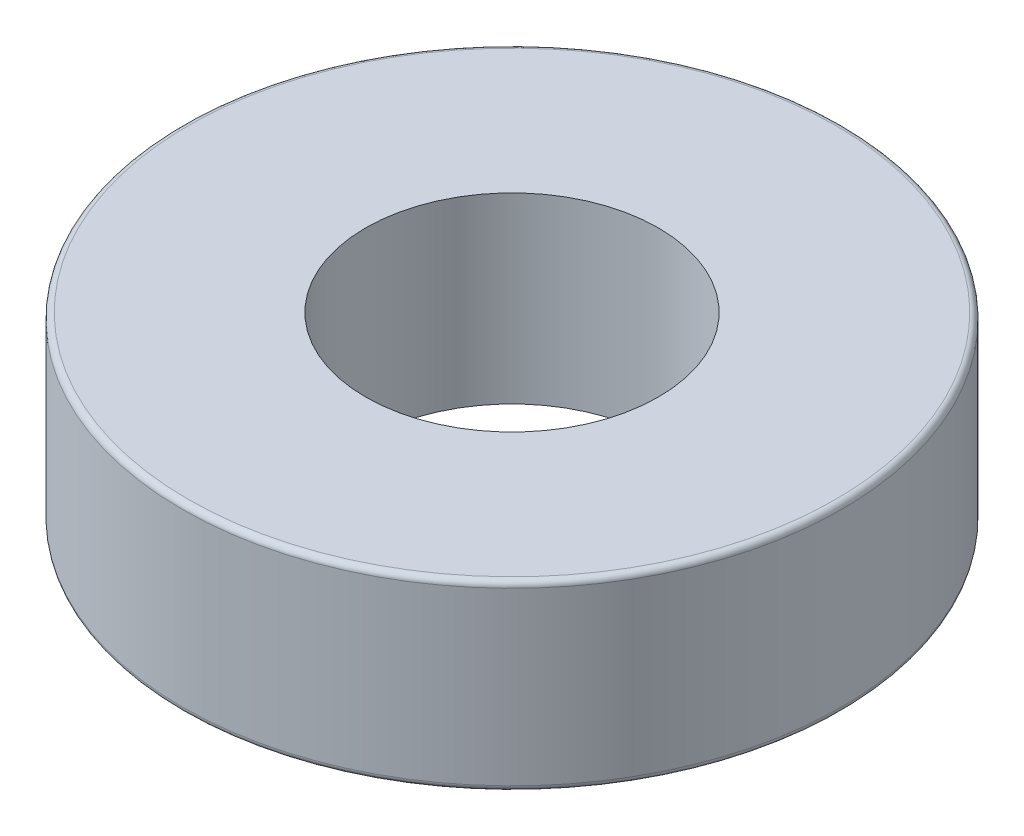
ISO-10303-21;
HEADER;
FILE_DESCRIPTION(('STEP AP214'),'2;1');
FILE_NAME('part.step','',(''),(''),'','','');
FILE_SCHEMA(('AUTOMOTIVE_DESIGN { 1 0 10303 214 1 1 1 1 }'));
ENDSEC;
DATA;
#1=APPLICATION_CONTEXT('core data for automotive mechanical design processes');
#2=APPLICATION_PROTOCOL_DEFINITION('international standard','automotive_design',2000,#1);
#3=PRODUCT_CONTEXT('',#1,'mechanical');
#4=PRODUCT('Part','Part','',(#3));
#5=PRODUCT_RELATED_PRODUCT_CATEGORY('part','',(#4));
#6=PRODUCT_DEFINITION_FORMATION('','',#4);
#7=PRODUCT_DEFINITION_CONTEXT('part definition',#1,'design');
#8=PRODUCT_DEFINITION('design','',#6,#7);
#9=PRODUCT_DEFINITION_SHAPE('','',#8);
#10=(LENGTH_UNIT() NAMED_UNIT(*) SI_UNIT(.MILLI.,.METRE.));
#11=(NAMED_UNIT(*) PLANE_ANGLE_UNIT() SI_UNIT($,.RADIAN.));
#12=(NAMED_UNIT(*) SI_UNIT($,.STERADIAN.) SOLID_ANGLE_UNIT());
#13=UNCERTAINTY_MEASURE_WITH_UNIT(LENGTH_MEASURE(1.E-05),#10,'distance_accuracy_value','');
#14=(GEOMETRIC_REPRESENTATION_CONTEXT(3) GLOBAL_UNCERTAINTY_ASSIGNED_CONTEXT((#13)) GLOBAL_UNIT_ASSIGNED_CONTEXT((#10,
#11,#12)) REPRESENTATION_CONTEXT('',''));
#15=CARTESIAN_POINT('',(0.,0.,0.));
#16=DIRECTION('',(0.,0.,1.));
#17=DIRECTION('',(1.,0.,0.));
#18=AXIS2_PLACEMENT_3D('',#15,#16,#17);
#19=CARTESIAN_POINT('',(0.,0.254,0.));
#20=DIRECTION('',(0.,-1.,0.));
#21=DIRECTION('',(0.,0.,-1.));
#22=AXIS2_PLACEMENT_3D('',#19,#20,#21);
#23=TOROIDAL_SURFACE('',#22,14.0335,0.254);
#24=CARTESIAN_POINT('',(0.,0.254,0.));
#25=DIRECTION('',(0.,-1.,0.));
#26=DIRECTION('',(0.,0.,-1.));
#27=AXIS2_PLACEMENT_3D('',#24,#25,#26);
#28=CIRCLE('',#27,14.2875);
#29=CARTESIAN_POINT('',(0.,0.254,-14.2875));
#30=VERTEX_POINT('',#29);
#31=EDGE_CURVE('E54',#30,#30,#28,.F.);
#32=ORIENTED_EDGE('',*,*,#31,.F.);
#33=EDGE_LOOP('',(#32));
#34=FACE_BOUND('',#33,.T.);
#35=CARTESIAN_POINT('',(0.,0.,0.));
#36=DIRECTION('',(0.,1.,0.));
#37=DIRECTION('',(0.,0.,-1.));
#38=AXIS2_PLACEMENT_3D('',#35,#36,#37);
#39=CIRCLE('',#38,14.0335);
#40=CARTESIAN_POINT('',(0.,0.,14.0335));
#41=VERTEX_POINT('',#40);
#42=CARTESIAN_POINT('',(0.,0.,-14.0335));
#43=VERTEX_POINT('',#42);
#44=EDGE_CURVE('E46',#41,#43,#39,.F.);
#45=ORIENTED_EDGE('',*,*,#44,.F.);
#46=CARTESIAN_POINT('',(0.,0.,0.));
#47=DIRECTION('',(0.,1.,0.));
#48=DIRECTION('',(0.,0.,1.));
#49=AXIS2_PLACEMENT_3D('',#46,#47,#48);
#50=CIRCLE('',#49,14.0335);
#51=EDGE_CURVE('E44',#43,#41,#50,.F.);
#52=ORIENTED_EDGE('',*,*,#51,.F.);
#53=EDGE_LOOP('',(#45,#52));
#54=FACE_BOUND('',#53,.T.);
#55=ADVANCED_FACE('F16',(#34,#54),#23,.T.);
#56=CARTESIAN_POINT('',(0.,0.,0.));
#57=DIRECTION('',(0.,-1.,0.));
#58=DIRECTION('',(0.,0.,-1.));
#59=AXIS2_PLACEMENT_3D('',#56,#57,#58);
#60=CYLINDRICAL_SURFACE('',#59,14.2875);
#61=CARTESIAN_POINT('',(0.,7.6708,0.));
#62=DIRECTION('',(0.,1.,0.));
#63=DIRECTION('',(0.,0.,1.));
#64=AXIS2_PLACEMENT_3D('',#61,#62,#63);
#65=CIRCLE('',#64,14.2875);
#66=CARTESIAN_POINT('',(0.,7.6708,14.2875));
#67=VERTEX_POINT('',#66);
#68=EDGE_CURVE('E50',#67,#67,#65,.T.);
#69=ORIENTED_EDGE('',*,*,#68,.F.);
#70=EDGE_LOOP('',(#69));
#71=FACE_BOUND('',#70,.T.);
#72=ORIENTED_EDGE('',*,*,#31,.T.);
#73=EDGE_LOOP('',(#72));
#74=FACE_BOUND('',#73,.T.);
#75=ADVANCED_FACE('F72',(#71,#74),#60,.T.);
#76=CARTESIAN_POINT('',(6.35,0.,0.));
#77=DIRECTION('',(0.,-1.,0.));
#78=DIRECTION('',(0.,0.,-1.));
#79=AXIS2_PLACEMENT_3D('',#76,#77,#78);
#80=PLANE('',#79);
#81=CARTESIAN_POINT('',(0.,0.,0.));
#82=DIRECTION('',(0.,-1.,0.));
#83=DIRECTION('',(0.,0.,-1.));
#84=AXIS2_PLACEMENT_3D('',#81,#82,#83);
#85=CIRCLE('',#84,6.35);
#86=CARTESIAN_POINT('',(0.,0.,-6.35));
#87=VERTEX_POINT('',#86);
#88=EDGE_CURVE('E87',#87,#87,#85,.F.);
#89=ORIENTED_EDGE('',*,*,#88,.T.);
#90=EDGE_LOOP('',(#89));
#91=FACE_BOUND('',#90,.T.);
#92=ORIENTED_EDGE('',*,*,#51,.T.);
#93=ORIENTED_EDGE('',*,*,#44,.T.);
#94=EDGE_LOOP('',(#92,#93));
#95=FACE_BOUND('',#94,.T.);
#96=ADVANCED_FACE('F53',(#91,#95),#80,.T.);
#97=CARTESIAN_POINT('',(0.,7.6708,0.));
#98=DIRECTION('',(0.,1.,0.));
#99=DIRECTION('',(0.,0.,1.));
#100=AXIS2_PLACEMENT_3D('',#97,#98,#99);
#101=TOROIDAL_SURFACE('',#100,14.0335,0.254);
#102=ORIENTED_EDGE('',*,*,#68,.T.);
#103=EDGE_LOOP('',(#102));
#104=FACE_BOUND('',#103,.T.);
#105=CARTESIAN_POINT('',(0.,7.9248,0.));
#106=DIRECTION('',(0.,-1.,0.));
#107=DIRECTION('',(0.,0.,1.));
#108=AXIS2_PLACEMENT_3D('',#105,#106,#107);
#109=CIRCLE('',#108,14.0335);
#110=CARTESIAN_POINT('',(0.,7.9248,-14.0335));
#111=VERTEX_POINT('',#110);
#112=CARTESIAN_POINT('',(0.,7.9248,14.0335));
#113=VERTEX_POINT('',#112);
#114=EDGE_CURVE('E28',#111,#113,#109,.F.);
#115=ORIENTED_EDGE('',*,*,#114,.F.);
#116=CARTESIAN_POINT('',(0.,7.9248,0.));
#117=DIRECTION('',(0.,-1.,0.));
#118=DIRECTION('',(0.,0.,-1.));
#119=AXIS2_PLACEMENT_3D('',#116,#117,#118);
#120=CIRCLE('',#119,14.0335);
#121=EDGE_CURVE('E92',#113,#111,#120,.F.);
#122=ORIENTED_EDGE('',*,*,#121,.F.);
#123=EDGE_LOOP('',(#115,#122));
#124=FACE_BOUND('',#123,.T.);
#125=ADVANCED_FACE('F71',(#104,#124),#101,.T.);
#126=CARTESIAN_POINT('',(0.,0.,0.));
#127=DIRECTION('',(0.,-1.,0.));
#128=DIRECTION('',(0.,0.,-1.));
#129=AXIS2_PLACEMENT_3D('',#126,#127,#128);
#130=CYLINDRICAL_SURFACE('',#129,6.35);
#131=ORIENTED_EDGE('',*,*,#88,.F.);
#132=EDGE_LOOP('',(#131));
#133=FACE_BOUND('',#132,.T.);
#134=CARTESIAN_POINT('',(0.,7.9248,0.));
#135=DIRECTION('',(0.,-1.,0.));
#136=DIRECTION('',(0.,0.,-1.));
#137=AXIS2_PLACEMENT_3D('',#134,#135,#136);
#138=CIRCLE('',#137,6.35);
#139=CARTESIAN_POINT('',(0.,7.9248,-6.35));
#140=VERTEX_POINT('',#139);
#141=EDGE_CURVE('E11',#140,#140,#138,.T.);
#142=ORIENTED_EDGE('',*,*,#141,.F.);
#143=EDGE_LOOP('',(#142));
#144=FACE_BOUND('',#143,.T.);
#145=ADVANCED_FACE('F124',(#133,#144),#130,.F.);
#146=CARTESIAN_POINT('',(6.35,7.9248,0.));
#147=DIRECTION('',(0.,1.,0.));
#148=DIRECTION('',(0.,0.,1.));
#149=AXIS2_PLACEMENT_3D('',#146,#147,#148);
#150=PLANE('',#149);
#151=ORIENTED_EDGE('',*,*,#141,.T.);
#152=EDGE_LOOP('',(#151));
#153=FACE_BOUND('',#152,.T.);
#154=ORIENTED_EDGE('',*,*,#121,.T.);
#155=ORIENTED_EDGE('',*,*,#114,.T.);
#156=EDGE_LOOP('',(#154,#155));
#157=FACE_BOUND('',#156,.T.);
#158=ADVANCED_FACE('F108',(#153,#157),#150,.T.);
#159=CLOSED_SHELL('',(#55,#75,#96,#125,#145,#158));
#160=MANIFOLD_SOLID_BREP('B1',#159);
#161=ADVANCED_BREP_SHAPE_REPRESENTATION('',(#18,#160),#14);
#162=SHAPE_DEFINITION_REPRESENTATION(#9,#161);
ENDSEC;
END-ISO-10303-21;
